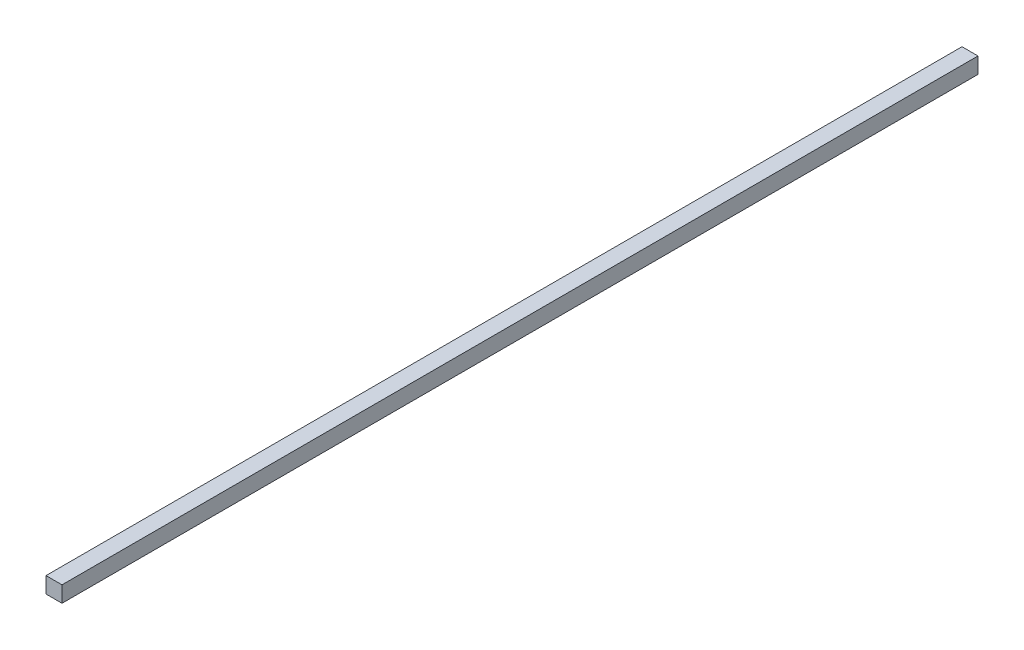
ISO-10303-21;
HEADER;
FILE_DESCRIPTION(('STEP AP214'),'2;1');
FILE_NAME('part.step','',(''),(''),'','','');
FILE_SCHEMA(('AUTOMOTIVE_DESIGN { 1 0 10303 214 1 1 1 1 }'));
ENDSEC;
DATA;
#1=APPLICATION_CONTEXT('core data for automotive mechanical design processes');
#2=APPLICATION_PROTOCOL_DEFINITION('international standard','automotive_design',2000,#1);
#3=PRODUCT_CONTEXT('',#1,'mechanical');
#4=PRODUCT('Part','Part','',(#3));
#5=PRODUCT_RELATED_PRODUCT_CATEGORY('part','',(#4));
#6=PRODUCT_DEFINITION_FORMATION('','',#4);
#7=PRODUCT_DEFINITION_CONTEXT('part definition',#1,'design');
#8=PRODUCT_DEFINITION('design','',#6,#7);
#9=PRODUCT_DEFINITION_SHAPE('','',#8);
#10=(LENGTH_UNIT() NAMED_UNIT(*) SI_UNIT(.MILLI.,.METRE.));
#11=(NAMED_UNIT(*) PLANE_ANGLE_UNIT() SI_UNIT($,.RADIAN.));
#12=(NAMED_UNIT(*) SI_UNIT($,.STERADIAN.) SOLID_ANGLE_UNIT());
#13=UNCERTAINTY_MEASURE_WITH_UNIT(LENGTH_MEASURE(1.E-05),#10,'distance_accuracy_value','');
#14=(GEOMETRIC_REPRESENTATION_CONTEXT(3) GLOBAL_UNCERTAINTY_ASSIGNED_CONTEXT((#13)) GLOBAL_UNIT_ASSIGNED_CONTEXT((#10,
#11,#12)) REPRESENTATION_CONTEXT('',''));
#15=CARTESIAN_POINT('',(0.,0.,0.));
#16=DIRECTION('',(0.,0.,1.));
#17=DIRECTION('',(1.,0.,0.));
#18=AXIS2_PLACEMENT_3D('',#15,#16,#17);
#19=CARTESIAN_POINT('',(10.,-10.,1145.));
#20=DIRECTION('',(-1.,0.,0.));
#21=DIRECTION('',(0.,0.,1.));
#22=AXIS2_PLACEMENT_3D('',#19,#20,#21);
#23=PLANE('',#22);
#24=DIRECTION('',(0.,1.,0.));
#25=VECTOR('',#24,1.);
#26=CARTESIAN_POINT('',(10.,-10.,0.));
#27=LINE('',#26,#25);
#28=CARTESIAN_POINT('',(10.,-10.,0.));
#29=VERTEX_POINT('',#28);
#30=CARTESIAN_POINT('',(10.,10.,0.));
#31=VERTEX_POINT('',#30);
#32=EDGE_CURVE('E97',#29,#31,#27,.T.);
#33=ORIENTED_EDGE('',*,*,#32,.T.);
#34=DIRECTION('',(0.,0.,-1.));
#35=VECTOR('',#34,1.);
#36=CARTESIAN_POINT('',(10.,10.,1145.));
#37=LINE('',#36,#35);
#38=CARTESIAN_POINT('',(10.,10.,1145.));
#39=VERTEX_POINT('',#38);
#40=EDGE_CURVE('E11',#39,#31,#37,.T.);
#41=ORIENTED_EDGE('',*,*,#40,.F.);
#42=DIRECTION('',(0.,1.,0.));
#43=VECTOR('',#42,1.);
#44=CARTESIAN_POINT('',(10.,-10.,1145.));
#45=LINE('',#44,#43);
#46=CARTESIAN_POINT('',(10.,-10.,1145.));
#47=VERTEX_POINT('',#46);
#48=EDGE_CURVE('E85',#47,#39,#45,.T.);
#49=ORIENTED_EDGE('',*,*,#48,.F.);
#50=DIRECTION('',(0.,0.,-1.));
#51=VECTOR('',#50,1.);
#52=CARTESIAN_POINT('',(10.,-10.,1145.));
#53=LINE('',#52,#51);
#54=EDGE_CURVE('E93',#47,#29,#53,.T.);
#55=ORIENTED_EDGE('',*,*,#54,.T.);
#56=EDGE_LOOP('',(#33,#41,#49,#55));
#57=FACE_BOUND('',#56,.T.);
#58=ADVANCED_FACE('F34',(#57),#23,.F.);
#59=CARTESIAN_POINT('',(-10.,10.,1145.));
#60=DIRECTION('',(0.,-1.,0.));
#61=DIRECTION('',(0.,0.,-1.));
#62=AXIS2_PLACEMENT_3D('',#59,#60,#61);
#63=PLANE('',#62);
#64=DIRECTION('',(-1.,0.,0.));
#65=VECTOR('',#64,1.);
#66=CARTESIAN_POINT('',(-10.,10.,0.));
#67=LINE('',#66,#65);
#68=CARTESIAN_POINT('',(-10.,10.,0.));
#69=VERTEX_POINT('',#68);
#70=EDGE_CURVE('E89',#31,#69,#67,.T.);
#71=ORIENTED_EDGE('',*,*,#70,.T.);
#72=DIRECTION('',(0.,0.,-1.));
#73=VECTOR('',#72,1.);
#74=CARTESIAN_POINT('',(-10.,10.,1145.));
#75=LINE('',#74,#73);
#76=CARTESIAN_POINT('',(-10.,10.,1145.));
#77=VERTEX_POINT('',#76);
#78=EDGE_CURVE('E42',#77,#69,#75,.T.);
#79=ORIENTED_EDGE('',*,*,#78,.F.);
#80=DIRECTION('',(-1.,0.,0.));
#81=VECTOR('',#80,1.);
#82=CARTESIAN_POINT('',(-10.,10.,1145.));
#83=LINE('',#82,#81);
#84=EDGE_CURVE('E80',#39,#77,#83,.T.);
#85=ORIENTED_EDGE('',*,*,#84,.F.);
#86=ORIENTED_EDGE('',*,*,#40,.T.);
#87=EDGE_LOOP('',(#71,#79,#85,#86));
#88=FACE_BOUND('',#87,.T.);
#89=ADVANCED_FACE('F88',(#88),#63,.F.);
#90=CARTESIAN_POINT('',(-10.,-10.,1145.));
#91=DIRECTION('',(1.,0.,0.));
#92=DIRECTION('',(0.,0.,-1.));
#93=AXIS2_PLACEMENT_3D('',#90,#91,#92);
#94=PLANE('',#93);
#95=DIRECTION('',(0.,-1.,0.));
#96=VECTOR('',#95,1.);
#97=CARTESIAN_POINT('',(-10.,-10.,0.));
#98=LINE('',#97,#96);
#99=CARTESIAN_POINT('',(-10.,-10.,0.));
#100=VERTEX_POINT('',#99);
#101=EDGE_CURVE('E67',#69,#100,#98,.T.);
#102=ORIENTED_EDGE('',*,*,#101,.T.);
#103=DIRECTION('',(0.,0.,-1.));
#104=VECTOR('',#103,1.);
#105=CARTESIAN_POINT('',(-10.,-10.,1145.));
#106=LINE('',#105,#104);
#107=CARTESIAN_POINT('',(-10.,-10.,1145.));
#108=VERTEX_POINT('',#107);
#109=EDGE_CURVE('E90',#108,#100,#106,.T.);
#110=ORIENTED_EDGE('',*,*,#109,.F.);
#111=DIRECTION('',(0.,-1.,0.));
#112=VECTOR('',#111,1.);
#113=CARTESIAN_POINT('',(-10.,-10.,1145.));
#114=LINE('',#113,#112);
#115=EDGE_CURVE('E83',#77,#108,#114,.T.);
#116=ORIENTED_EDGE('',*,*,#115,.F.);
#117=ORIENTED_EDGE('',*,*,#78,.T.);
#118=EDGE_LOOP('',(#102,#110,#116,#117));
#119=FACE_BOUND('',#118,.T.);
#120=ADVANCED_FACE('F91',(#119),#94,.F.);
#121=CARTESIAN_POINT('',(-10.,-10.,1145.));
#122=DIRECTION('',(0.,1.,0.));
#123=DIRECTION('',(0.,0.,1.));
#124=AXIS2_PLACEMENT_3D('',#121,#122,#123);
#125=PLANE('',#124);
#126=DIRECTION('',(1.,0.,0.));
#127=VECTOR('',#126,1.);
#128=CARTESIAN_POINT('',(-10.,-10.,0.));
#129=LINE('',#128,#127);
#130=EDGE_CURVE('E73',#100,#29,#129,.T.);
#131=ORIENTED_EDGE('',*,*,#130,.T.);
#132=ORIENTED_EDGE('',*,*,#54,.F.);
#133=DIRECTION('',(1.,0.,0.));
#134=VECTOR('',#133,1.);
#135=CARTESIAN_POINT('',(-10.,-10.,1145.));
#136=LINE('',#135,#134);
#137=EDGE_CURVE('E50',#108,#47,#136,.T.);
#138=ORIENTED_EDGE('',*,*,#137,.F.);
#139=ORIENTED_EDGE('',*,*,#109,.T.);
#140=EDGE_LOOP('',(#131,#132,#138,#139));
#141=FACE_BOUND('',#140,.T.);
#142=ADVANCED_FACE('F104',(#141),#125,.F.);
#143=CARTESIAN_POINT('',(0.,0.,1145.));
#144=DIRECTION('',(0.,0.,-1.));
#145=DIRECTION('',(-1.,0.,0.));
#146=AXIS2_PLACEMENT_3D('',#143,#144,#145);
#147=PLANE('',#146);
#148=ORIENTED_EDGE('',*,*,#48,.T.);
#149=ORIENTED_EDGE('',*,*,#84,.T.);
#150=ORIENTED_EDGE('',*,*,#115,.T.);
#151=ORIENTED_EDGE('',*,*,#137,.T.);
#152=EDGE_LOOP('',(#148,#149,#150,#151));
#153=FACE_BOUND('',#152,.T.);
#154=ADVANCED_FACE('F81',(#153),#147,.F.);
#155=CARTESIAN_POINT('',(0.,0.,0.));
#156=DIRECTION('',(0.,0.,-1.));
#157=DIRECTION('',(-1.,0.,0.));
#158=AXIS2_PLACEMENT_3D('',#155,#156,#157);
#159=PLANE('',#158);
#160=ORIENTED_EDGE('',*,*,#32,.F.);
#161=ORIENTED_EDGE('',*,*,#130,.F.);
#162=ORIENTED_EDGE('',*,*,#101,.F.);
#163=ORIENTED_EDGE('',*,*,#70,.F.);
#164=EDGE_LOOP('',(#160,#161,#162,#163));
#165=FACE_BOUND('',#164,.T.);
#166=ADVANCED_FACE('F107',(#165),#159,.T.);
#167=CLOSED_SHELL('',(#58,#89,#120,#142,#154,#166));
#168=MANIFOLD_SOLID_BREP('B2',#167);
#169=ADVANCED_BREP_SHAPE_REPRESENTATION('',(#18,#168),#14);
#170=SHAPE_DEFINITION_REPRESENTATION(#9,#169);
ENDSEC;
END-ISO-10303-21;
